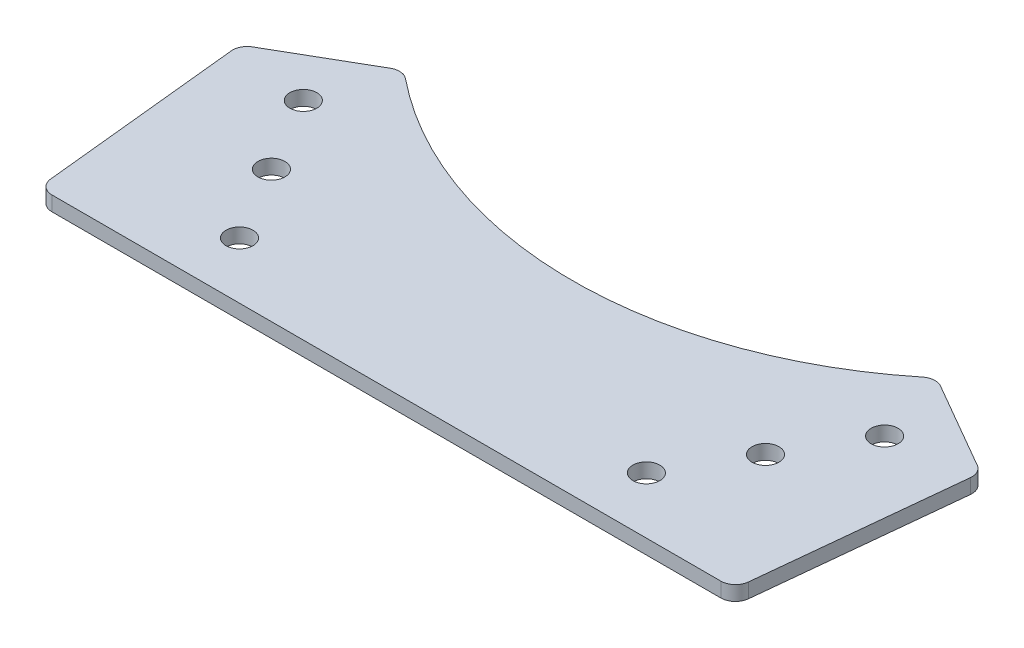
ISO-10303-21;
HEADER;
FILE_DESCRIPTION(('STEP AP214'),'2;1');
FILE_NAME('part.step','',(''),(''),'','','');
FILE_SCHEMA(('AUTOMOTIVE_DESIGN { 1 0 10303 214 1 1 1 1 }'));
ENDSEC;
DATA;
#1=APPLICATION_CONTEXT('core data for automotive mechanical design processes');
#2=APPLICATION_PROTOCOL_DEFINITION('international standard','automotive_design',2000,#1);
#3=PRODUCT_CONTEXT('',#1,'mechanical');
#4=PRODUCT('Part','Part','',(#3));
#5=PRODUCT_RELATED_PRODUCT_CATEGORY('part','',(#4));
#6=PRODUCT_DEFINITION_FORMATION('','',#4);
#7=PRODUCT_DEFINITION_CONTEXT('part definition',#1,'design');
#8=PRODUCT_DEFINITION('design','',#6,#7);
#9=PRODUCT_DEFINITION_SHAPE('','',#8);
#10=(LENGTH_UNIT() NAMED_UNIT(*) SI_UNIT(.MILLI.,.METRE.));
#11=(NAMED_UNIT(*) PLANE_ANGLE_UNIT() SI_UNIT($,.RADIAN.));
#12=(NAMED_UNIT(*) SI_UNIT($,.STERADIAN.) SOLID_ANGLE_UNIT());
#13=UNCERTAINTY_MEASURE_WITH_UNIT(LENGTH_MEASURE(1.E-05),#10,'distance_accuracy_value','');
#14=(GEOMETRIC_REPRESENTATION_CONTEXT(3) GLOBAL_UNCERTAINTY_ASSIGNED_CONTEXT((#13)) GLOBAL_UNIT_ASSIGNED_CONTEXT((#10,
#11,#12)) REPRESENTATION_CONTEXT('',''));
#15=CARTESIAN_POINT('',(0.,0.,0.));
#16=DIRECTION('',(0.,0.,1.));
#17=DIRECTION('',(1.,0.,0.));
#18=AXIS2_PLACEMENT_3D('',#15,#16,#17);
#19=CARTESIAN_POINT('',(0.,1.6,0.));
#20=DIRECTION('',(0.,1.,0.));
#21=DIRECTION('',(0.,0.,1.));
#22=AXIS2_PLACEMENT_3D('',#19,#20,#21);
#23=PLANE('',#22);
#24=CARTESIAN_POINT('',(26.9875000000006,1.6,-3.62722116926478));
#25=DIRECTION('',(0.,-1.,0.));
#26=DIRECTION('',(0.,0.,-1.));
#27=AXIS2_PLACEMENT_3D('',#24,#25,#26);
#28=CIRCLE('',#27,1.47319999999998);
#29=CARTESIAN_POINT('',(26.9875000000006,1.6,-5.10042116926477));
#30=VERTEX_POINT('',#29);
#31=EDGE_CURVE('E303',#30,#30,#28,.T.);
#32=ORIENTED_EDGE('',*,*,#31,.T.);
#33=EDGE_LOOP('',(#32));
#34=FACE_BOUND('',#33,.T.);
#35=CARTESIAN_POINT('',(-26.9875000000006,1.6,-3.62722116926478));
#36=DIRECTION('',(0.,-1.,0.));
#37=DIRECTION('',(0.,0.,-1.));
#38=AXIS2_PLACEMENT_3D('',#35,#36,#37);
#39=CIRCLE('',#38,1.47319999999998);
#40=CARTESIAN_POINT('',(-26.9875000000006,1.6,-5.10042116926477));
#41=VERTEX_POINT('',#40);
#42=EDGE_CURVE('E285',#41,#41,#39,.T.);
#43=ORIENTED_EDGE('',*,*,#42,.T.);
#44=EDGE_LOOP('',(#43));
#45=FACE_BOUND('',#44,.T.);
#46=DIRECTION('',(0.102215076971525,0.,-0.994762322386461));
#47=VECTOR('',#46,1.);
#48=CARTESIAN_POINT('',(38.1,1.6,9.525));
#49=LINE('',#48,#47);
#50=CARTESIAN_POINT('',(38.1159507557428,1.6,9.3697664346923));
#51=VERTEX_POINT('',#50);
#52=CARTESIAN_POINT('',(40.3761410282364,1.6,-12.6265201319886));
#53=VERTEX_POINT('',#52);
#54=EDGE_CURVE('E129',#51,#53,#49,.T.);
#55=ORIENTED_EDGE('',*,*,#54,.T.);
#56=CARTESIAN_POINT('',(38.7969558414479,1.6,-12.7887865666809));
#57=DIRECTION('',(0.,1.,0.));
#58=DIRECTION('',(0.,0.,1.));
#59=AXIS2_PLACEMENT_3D('',#56,#57,#58);
#60=CIRCLE('',#59,1.5875);
#61=CARTESIAN_POINT('',(39.5907058414478,1.6,-14.1636018951887));
#62=VERTEX_POINT('',#61);
#63=EDGE_CURVE('E123',#53,#62,#60,.T.);
#64=ORIENTED_EDGE('',*,*,#63,.T.);
#65=DIRECTION('',(-0.866025403784442,0.,-0.499999999999995));
#66=VECTOR('',#65,1.);
#67=CARTESIAN_POINT('',(40.48125,1.6,-13.6494459855234));
#68=LINE('',#67,#66);
#69=CARTESIAN_POINT('',(30.0464786074915,1.6,-19.6739640579203));
#70=VERTEX_POINT('',#69);
#71=EDGE_CURVE('E126',#62,#70,#68,.T.);
#72=ORIENTED_EDGE('',*,*,#71,.T.);
#73=CARTESIAN_POINT('',(29.2527286074915,1.6,-18.2991487294125));
#74=DIRECTION('',(0.,1.,0.));
#75=DIRECTION('',(0.,0.,1.));
#76=AXIS2_PLACEMENT_3D('',#73,#74,#75);
#77=CIRCLE('',#76,1.5875);
#78=CARTESIAN_POINT('',(28.2534790738512,1.6,-19.5327031949792));
#79=VERTEX_POINT('',#78);
#80=EDGE_CURVE('E171',#70,#79,#77,.T.);
#81=ORIENTED_EDGE('',*,*,#80,.T.);
#82=CARTESIAN_POINT('',(0.,1.6,-54.4110835254422));
#83=DIRECTION('',(0.,1.,0.));
#84=DIRECTION('',(0.,0.,1.));
#85=AXIS2_PLACEMENT_3D('',#82,#83,#84);
#86=CIRCLE('',#85,44.8860835254422);
#87=CARTESIAN_POINT('',(-28.2534790738512,1.6,-19.5327031949792));
#88=VERTEX_POINT('',#87);
#89=EDGE_CURVE('E200',#88,#79,#86,.T.);
#90=ORIENTED_EDGE('',*,*,#89,.F.);
#91=CARTESIAN_POINT('',(-29.2527286074915,1.6,-18.2991487294125));
#92=DIRECTION('',(0.,1.,0.));
#93=DIRECTION('',(0.,0.,1.));
#94=AXIS2_PLACEMENT_3D('',#91,#92,#93);
#95=CIRCLE('',#94,1.5875);
#96=CARTESIAN_POINT('',(-30.0464786074915,1.6,-19.6739640579203));
#97=VERTEX_POINT('',#96);
#98=EDGE_CURVE('E173',#88,#97,#95,.T.);
#99=ORIENTED_EDGE('',*,*,#98,.T.);
#100=DIRECTION('',(0.866025403784442,0.,-0.499999999999995));
#101=VECTOR('',#100,1.);
#102=CARTESIAN_POINT('',(-40.48125,1.6,-13.6494459855234));
#103=LINE('',#102,#101);
#104=CARTESIAN_POINT('',(-39.5907058414479,1.6,-14.1636018951887));
#105=VERTEX_POINT('',#104);
#106=EDGE_CURVE('E153',#105,#97,#103,.T.);
#107=ORIENTED_EDGE('',*,*,#106,.F.);
#108=CARTESIAN_POINT('',(-38.7969558414479,1.6,-12.7887865666809));
#109=DIRECTION('',(0.,1.,0.));
#110=DIRECTION('',(0.,0.,1.));
#111=AXIS2_PLACEMENT_3D('',#108,#109,#110);
#112=CIRCLE('',#111,1.5875);
#113=CARTESIAN_POINT('',(-40.3761410282364,1.6,-12.6265201319886));
#114=VERTEX_POINT('',#113);
#115=EDGE_CURVE('E175',#105,#114,#112,.T.);
#116=ORIENTED_EDGE('',*,*,#115,.T.);
#117=DIRECTION('',(-0.102215076971525,0.,-0.994762322386461));
#118=VECTOR('',#117,1.);
#119=CARTESIAN_POINT('',(-38.1,1.6,9.525));
#120=LINE('',#119,#118);
#121=CARTESIAN_POINT('',(-38.1159507557428,1.6,9.3697664346923));
#122=VERTEX_POINT('',#121);
#123=EDGE_CURVE('E220',#122,#114,#120,.T.);
#124=ORIENTED_EDGE('',*,*,#123,.F.);
#125=CARTESIAN_POINT('',(-36.5367655689543,1.6,9.2075));
#126=DIRECTION('',(0.,1.,0.));
#127=DIRECTION('',(0.,0.,1.));
#128=AXIS2_PLACEMENT_3D('',#125,#126,#127);
#129=CIRCLE('',#128,1.5875);
#130=CARTESIAN_POINT('',(-36.5367655689543,1.6,10.795));
#131=VERTEX_POINT('',#130);
#132=EDGE_CURVE('E48',#122,#131,#129,.T.);
#133=ORIENTED_EDGE('',*,*,#132,.T.);
#134=DIRECTION('',(-1.,0.,0.));
#135=VECTOR('',#134,1.);
#136=CARTESIAN_POINT('',(-37.9695033528789,1.6,10.795));
#137=LINE('',#136,#135);
#138=CARTESIAN_POINT('',(36.5367655689543,1.6,10.795));
#139=VERTEX_POINT('',#138);
#140=EDGE_CURVE('E206',#139,#131,#137,.T.);
#141=ORIENTED_EDGE('',*,*,#140,.F.);
#142=CARTESIAN_POINT('',(36.5367655689543,1.6,9.2075));
#143=DIRECTION('',(0.,1.,0.));
#144=DIRECTION('',(0.,0.,1.));
#145=AXIS2_PLACEMENT_3D('',#142,#143,#144);
#146=CIRCLE('',#145,1.5875);
#147=EDGE_CURVE('E134',#139,#51,#146,.T.);
#148=ORIENTED_EDGE('',*,*,#147,.T.);
#149=EDGE_LOOP('',(#55,#64,#72,#81,#90,#99,#107,#116,#124,#133,#141,#148));
#150=FACE_BOUND('',#149,.T.);
#151=CARTESIAN_POINT('',(-31.7500000000007,1.6,-11.8761131403115));
#152=DIRECTION('',(0.,-1.,0.));
#153=DIRECTION('',(0.,0.,-1.));
#154=AXIS2_PLACEMENT_3D('',#151,#152,#153);
#155=CIRCLE('',#154,1.47319999999998);
#156=CARTESIAN_POINT('',(-31.7500000000007,1.6,-13.3493131403115));
#157=VERTEX_POINT('',#156);
#158=EDGE_CURVE('E278',#157,#157,#155,.T.);
#159=ORIENTED_EDGE('',*,*,#158,.T.);
#160=EDGE_LOOP('',(#159));
#161=FACE_BOUND('',#160,.T.);
#162=CARTESIAN_POINT('',(-22.2250000000005,1.6,4.62167080178193));
#163=DIRECTION('',(0.,-1.,0.));
#164=DIRECTION('',(0.,0.,-1.));
#165=AXIS2_PLACEMENT_3D('',#162,#163,#164);
#166=CIRCLE('',#165,1.47319999999998);
#167=CARTESIAN_POINT('',(-22.2250000000005,1.6,3.14847080178195));
#168=VERTEX_POINT('',#167);
#169=EDGE_CURVE('E291',#168,#168,#166,.T.);
#170=ORIENTED_EDGE('',*,*,#169,.T.);
#171=EDGE_LOOP('',(#170));
#172=FACE_BOUND('',#171,.T.);
#173=CARTESIAN_POINT('',(31.7500000000007,1.6,-11.8761131403115));
#174=DIRECTION('',(0.,-1.,0.));
#175=DIRECTION('',(0.,0.,-1.));
#176=AXIS2_PLACEMENT_3D('',#173,#174,#175);
#177=CIRCLE('',#176,1.47319999999999);
#178=CARTESIAN_POINT('',(31.7500000000007,1.6,-13.3493131403115));
#179=VERTEX_POINT('',#178);
#180=EDGE_CURVE('E297',#179,#179,#177,.T.);
#181=ORIENTED_EDGE('',*,*,#180,.T.);
#182=EDGE_LOOP('',(#181));
#183=FACE_BOUND('',#182,.T.);
#184=CARTESIAN_POINT('',(22.2250000000005,1.6,4.62167080178193));
#185=DIRECTION('',(0.,-1.,0.));
#186=DIRECTION('',(0.,0.,-1.));
#187=AXIS2_PLACEMENT_3D('',#184,#185,#186);
#188=CIRCLE('',#187,1.47319999999998);
#189=CARTESIAN_POINT('',(22.2250000000005,1.6,3.14847080178195));
#190=VERTEX_POINT('',#189);
#191=EDGE_CURVE('E308',#190,#190,#188,.T.);
#192=ORIENTED_EDGE('',*,*,#191,.T.);
#193=EDGE_LOOP('',(#192));
#194=FACE_BOUND('',#193,.T.);
#195=ADVANCED_FACE('F33',(#34,#45,#150,#161,#172,#183,#194),#23,.T.);
#196=CARTESIAN_POINT('',(0.,0.,0.));
#197=DIRECTION('',(0.,1.,0.));
#198=DIRECTION('',(0.,0.,1.));
#199=AXIS2_PLACEMENT_3D('',#196,#197,#198);
#200=PLANE('',#199);
#201=CARTESIAN_POINT('',(22.2250000000005,0.,4.62167080178193));
#202=DIRECTION('',(0.,-1.,0.));
#203=DIRECTION('',(0.,0.,-1.));
#204=AXIS2_PLACEMENT_3D('',#201,#202,#203);
#205=CIRCLE('',#204,1.47319999999998);
#206=CARTESIAN_POINT('',(22.2250000000005,0.,3.14847080178195));
#207=VERTEX_POINT('',#206);
#208=EDGE_CURVE('E311',#207,#207,#205,.T.);
#209=ORIENTED_EDGE('',*,*,#208,.F.);
#210=EDGE_LOOP('',(#209));
#211=FACE_BOUND('',#210,.T.);
#212=CARTESIAN_POINT('',(26.9875000000006,0.,-3.62722116926478));
#213=DIRECTION('',(0.,-1.,0.));
#214=DIRECTION('',(0.,0.,-1.));
#215=AXIS2_PLACEMENT_3D('',#212,#213,#214);
#216=CIRCLE('',#215,1.47319999999998);
#217=CARTESIAN_POINT('',(26.9875000000006,0.,-5.10042116926477));
#218=VERTEX_POINT('',#217);
#219=EDGE_CURVE('E305',#218,#218,#216,.T.);
#220=ORIENTED_EDGE('',*,*,#219,.F.);
#221=EDGE_LOOP('',(#220));
#222=FACE_BOUND('',#221,.T.);
#223=CARTESIAN_POINT('',(31.7500000000007,0.,-11.8761131403115));
#224=DIRECTION('',(0.,-1.,0.));
#225=DIRECTION('',(0.,0.,-1.));
#226=AXIS2_PLACEMENT_3D('',#223,#224,#225);
#227=CIRCLE('',#226,1.47319999999999);
#228=CARTESIAN_POINT('',(31.7500000000007,0.,-13.3493131403115));
#229=VERTEX_POINT('',#228);
#230=EDGE_CURVE('E300',#229,#229,#227,.T.);
#231=ORIENTED_EDGE('',*,*,#230,.F.);
#232=EDGE_LOOP('',(#231));
#233=FACE_BOUND('',#232,.T.);
#234=CARTESIAN_POINT('',(-22.2250000000005,0.,4.62167080178193));
#235=DIRECTION('',(0.,-1.,0.));
#236=DIRECTION('',(0.,0.,-1.));
#237=AXIS2_PLACEMENT_3D('',#234,#235,#236);
#238=CIRCLE('',#237,1.47319999999998);
#239=CARTESIAN_POINT('',(-22.2250000000005,0.,3.14847080178195));
#240=VERTEX_POINT('',#239);
#241=EDGE_CURVE('E294',#240,#240,#238,.T.);
#242=ORIENTED_EDGE('',*,*,#241,.F.);
#243=EDGE_LOOP('',(#242));
#244=FACE_BOUND('',#243,.T.);
#245=CARTESIAN_POINT('',(-26.9875000000006,0.,-3.62722116926478));
#246=DIRECTION('',(0.,-1.,0.));
#247=DIRECTION('',(0.,0.,-1.));
#248=AXIS2_PLACEMENT_3D('',#245,#246,#247);
#249=CIRCLE('',#248,1.47319999999998);
#250=CARTESIAN_POINT('',(-26.9875000000006,0.,-5.10042116926477));
#251=VERTEX_POINT('',#250);
#252=EDGE_CURVE('E288',#251,#251,#249,.T.);
#253=ORIENTED_EDGE('',*,*,#252,.F.);
#254=EDGE_LOOP('',(#253));
#255=FACE_BOUND('',#254,.T.);
#256=DIRECTION('',(-0.866025403784442,0.,-0.499999999999995));
#257=VECTOR('',#256,1.);
#258=CARTESIAN_POINT('',(40.48125,0.,-13.6494459855234));
#259=LINE('',#258,#257);
#260=CARTESIAN_POINT('',(39.5907058414478,0.,-14.1636018951887));
#261=VERTEX_POINT('',#260);
#262=CARTESIAN_POINT('',(30.0464786074915,0.,-19.6739640579203));
#263=VERTEX_POINT('',#262);
#264=EDGE_CURVE('E145',#261,#263,#259,.T.);
#265=ORIENTED_EDGE('',*,*,#264,.F.);
#266=CARTESIAN_POINT('',(38.7969558414479,0.,-12.7887865666809));
#267=DIRECTION('',(0.,1.,0.));
#268=DIRECTION('',(0.,0.,1.));
#269=AXIS2_PLACEMENT_3D('',#266,#267,#268);
#270=CIRCLE('',#269,1.5875);
#271=CARTESIAN_POINT('',(40.3761410282364,0.,-12.6265201319886));
#272=VERTEX_POINT('',#271);
#273=EDGE_CURVE('E148',#261,#272,#270,.F.);
#274=ORIENTED_EDGE('',*,*,#273,.T.);
#275=DIRECTION('',(0.102215076971525,0.,-0.994762322386461));
#276=VECTOR('',#275,1.);
#277=CARTESIAN_POINT('',(38.1,0.,9.525));
#278=LINE('',#277,#276);
#279=CARTESIAN_POINT('',(38.1159507557428,0.,9.3697664346923));
#280=VERTEX_POINT('',#279);
#281=EDGE_CURVE('E208',#280,#272,#278,.T.);
#282=ORIENTED_EDGE('',*,*,#281,.F.);
#283=CARTESIAN_POINT('',(36.5367655689543,0.,9.2075));
#284=DIRECTION('',(0.,1.,0.));
#285=DIRECTION('',(0.,0.,1.));
#286=AXIS2_PLACEMENT_3D('',#283,#284,#285);
#287=CIRCLE('',#286,1.5875);
#288=CARTESIAN_POINT('',(36.5367655689543,0.,10.795));
#289=VERTEX_POINT('',#288);
#290=EDGE_CURVE('E162',#280,#289,#287,.F.);
#291=ORIENTED_EDGE('',*,*,#290,.T.);
#292=DIRECTION('',(-1.,0.,0.));
#293=VECTOR('',#292,1.);
#294=CARTESIAN_POINT('',(-37.9695033528789,0.,10.795));
#295=LINE('',#294,#293);
#296=CARTESIAN_POINT('',(-36.5367655689543,0.,10.795));
#297=VERTEX_POINT('',#296);
#298=EDGE_CURVE('E210',#289,#297,#295,.T.);
#299=ORIENTED_EDGE('',*,*,#298,.T.);
#300=CARTESIAN_POINT('',(-36.5367655689543,0.,9.2075));
#301=DIRECTION('',(0.,1.,0.));
#302=DIRECTION('',(0.,0.,1.));
#303=AXIS2_PLACEMENT_3D('',#300,#301,#302);
#304=CIRCLE('',#303,1.5875);
#305=CARTESIAN_POINT('',(-38.1159507557428,0.,9.3697664346923));
#306=VERTEX_POINT('',#305);
#307=EDGE_CURVE('E149',#297,#306,#304,.F.);
#308=ORIENTED_EDGE('',*,*,#307,.T.);
#309=DIRECTION('',(-0.102215076971525,0.,-0.994762322386461));
#310=VECTOR('',#309,1.);
#311=CARTESIAN_POINT('',(-38.1,0.,9.525));
#312=LINE('',#311,#310);
#313=CARTESIAN_POINT('',(-40.3761410282364,0.,-12.6265201319886));
#314=VERTEX_POINT('',#313);
#315=EDGE_CURVE('E144',#306,#314,#312,.T.);
#316=ORIENTED_EDGE('',*,*,#315,.T.);
#317=CARTESIAN_POINT('',(-38.7969558414479,0.,-12.7887865666809));
#318=DIRECTION('',(0.,1.,0.));
#319=DIRECTION('',(0.,0.,1.));
#320=AXIS2_PLACEMENT_3D('',#317,#318,#319);
#321=CIRCLE('',#320,1.5875);
#322=CARTESIAN_POINT('',(-39.5907058414479,0.,-14.1636018951887));
#323=VERTEX_POINT('',#322);
#324=EDGE_CURVE('E160',#314,#323,#321,.F.);
#325=ORIENTED_EDGE('',*,*,#324,.T.);
#326=DIRECTION('',(0.866025403784442,0.,-0.499999999999995));
#327=VECTOR('',#326,1.);
#328=CARTESIAN_POINT('',(-40.48125,0.,-13.6494459855234));
#329=LINE('',#328,#327);
#330=CARTESIAN_POINT('',(-30.0464786074915,0.,-19.6739640579203));
#331=VERTEX_POINT('',#330);
#332=EDGE_CURVE('E223',#323,#331,#329,.T.);
#333=ORIENTED_EDGE('',*,*,#332,.T.);
#334=CARTESIAN_POINT('',(-29.2527286074915,0.,-18.2991487294125));
#335=DIRECTION('',(0.,1.,0.));
#336=DIRECTION('',(0.,0.,1.));
#337=AXIS2_PLACEMENT_3D('',#334,#335,#336);
#338=CIRCLE('',#337,1.5875);
#339=CARTESIAN_POINT('',(-28.2534790738512,0.,-19.5327031949792));
#340=VERTEX_POINT('',#339);
#341=EDGE_CURVE('E158',#331,#340,#338,.F.);
#342=ORIENTED_EDGE('',*,*,#341,.T.);
#343=CARTESIAN_POINT('',(0.,0.,-54.4110835254422));
#344=DIRECTION('',(0.,1.,0.));
#345=DIRECTION('',(0.,0.,1.));
#346=AXIS2_PLACEMENT_3D('',#343,#344,#345);
#347=CIRCLE('',#346,44.8860835254422);
#348=CARTESIAN_POINT('',(28.2534790738512,0.,-19.5327031949792));
#349=VERTEX_POINT('',#348);
#350=EDGE_CURVE('E197',#340,#349,#347,.T.);
#351=ORIENTED_EDGE('',*,*,#350,.T.);
#352=CARTESIAN_POINT('',(29.2527286074915,0.,-18.2991487294125));
#353=DIRECTION('',(0.,1.,0.));
#354=DIRECTION('',(0.,0.,1.));
#355=AXIS2_PLACEMENT_3D('',#352,#353,#354);
#356=CIRCLE('',#355,1.5875);
#357=EDGE_CURVE('E151',#349,#263,#356,.F.);
#358=ORIENTED_EDGE('',*,*,#357,.T.);
#359=EDGE_LOOP('',(#265,#274,#282,#291,#299,#308,#316,#325,#333,#342,#351,#358));
#360=FACE_BOUND('',#359,.T.);
#361=CARTESIAN_POINT('',(-31.7500000000007,0.,-11.8761131403115));
#362=DIRECTION('',(0.,-1.,0.));
#363=DIRECTION('',(0.,0.,-1.));
#364=AXIS2_PLACEMENT_3D('',#361,#362,#363);
#365=CIRCLE('',#364,1.47319999999998);
#366=CARTESIAN_POINT('',(-31.7500000000007,0.,-13.3493131403115));
#367=VERTEX_POINT('',#366);
#368=EDGE_CURVE('E280',#367,#367,#365,.T.);
#369=ORIENTED_EDGE('',*,*,#368,.F.);
#370=EDGE_LOOP('',(#369));
#371=FACE_BOUND('',#370,.T.);
#372=ADVANCED_FACE('F203',(#211,#222,#233,#244,#255,#360,#371),#200,.F.);
#373=CARTESIAN_POINT('',(-40.48125,26.2431222027927,-13.6494459855234));
#374=DIRECTION('',(-0.499999999999995,0.,-0.866025403784442));
#375=DIRECTION('',(-0.866025403784442,0.,0.499999999999995));
#376=AXIS2_PLACEMENT_3D('',#373,#374,#375);
#377=PLANE('',#376);
#378=ORIENTED_EDGE('',*,*,#332,.F.);
#379=DIRECTION('',(0.,-1.,0.));
#380=VECTOR('',#379,1.);
#381=CARTESIAN_POINT('',(-39.5907058414479,26.2431222027927,-14.1636018951887));
#382=LINE('',#381,#380);
#383=EDGE_CURVE('E189',#323,#105,#382,.F.);
#384=ORIENTED_EDGE('',*,*,#383,.T.);
#385=ORIENTED_EDGE('',*,*,#106,.T.);
#386=DIRECTION('',(0.,-1.,0.));
#387=VECTOR('',#386,1.);
#388=CARTESIAN_POINT('',(-30.0464786074915,26.2431222027927,-19.6739640579203));
#389=LINE('',#388,#387);
#390=EDGE_CURVE('E186',#97,#331,#389,.T.);
#391=ORIENTED_EDGE('',*,*,#390,.T.);
#392=EDGE_LOOP('',(#378,#384,#385,#391));
#393=FACE_BOUND('',#392,.T.);
#394=ADVANCED_FACE('F229',(#393),#377,.T.);
#395=CARTESIAN_POINT('',(-38.1,30.6823153380624,9.525));
#396=DIRECTION('',(-0.994762322386461,0.,0.102215076971525));
#397=DIRECTION('',(0.102215076971525,0.,0.994762322386461));
#398=AXIS2_PLACEMENT_3D('',#395,#396,#397);
#399=PLANE('',#398);
#400=ORIENTED_EDGE('',*,*,#123,.T.);
#401=DIRECTION('',(0.,-1.,0.));
#402=VECTOR('',#401,1.);
#403=CARTESIAN_POINT('',(-40.3761410282364,30.6823153380624,-12.6265201319886));
#404=LINE('',#403,#402);
#405=EDGE_CURVE('E183',#114,#314,#404,.T.);
#406=ORIENTED_EDGE('',*,*,#405,.T.);
#407=ORIENTED_EDGE('',*,*,#315,.F.);
#408=DIRECTION('',(0.,-1.,0.));
#409=VECTOR('',#408,1.);
#410=CARTESIAN_POINT('',(-38.1159507557428,30.6823153380624,9.3697664346923));
#411=LINE('',#410,#409);
#412=EDGE_CURVE('E181',#306,#122,#411,.F.);
#413=ORIENTED_EDGE('',*,*,#412,.T.);
#414=EDGE_LOOP('',(#400,#406,#407,#413));
#415=FACE_BOUND('',#414,.T.);
#416=ADVANCED_FACE('F272',(#415),#399,.T.);
#417=CARTESIAN_POINT('',(40.48125,26.2431222027927,-13.6494459855234));
#418=DIRECTION('',(-0.499999999999995,0.,0.866025403784442));
#419=DIRECTION('',(0.866025403784442,0.,0.499999999999995));
#420=AXIS2_PLACEMENT_3D('',#417,#418,#419);
#421=PLANE('',#420);
#422=ORIENTED_EDGE('',*,*,#71,.F.);
#423=DIRECTION('',(0.,-1.,0.));
#424=VECTOR('',#423,1.);
#425=CARTESIAN_POINT('',(39.5907058414478,26.2431222027927,-14.1636018951887));
#426=LINE('',#425,#424);
#427=EDGE_CURVE('E140',#62,#261,#426,.T.);
#428=ORIENTED_EDGE('',*,*,#427,.T.);
#429=ORIENTED_EDGE('',*,*,#264,.T.);
#430=DIRECTION('',(0.,1.,0.));
#431=VECTOR('',#430,1.);
#432=CARTESIAN_POINT('',(30.0464786074915,1.6,-19.6739640579203));
#433=LINE('',#432,#431);
#434=EDGE_CURVE('E143',#263,#70,#433,.T.);
#435=ORIENTED_EDGE('',*,*,#434,.T.);
#436=EDGE_LOOP('',(#422,#428,#429,#435));
#437=FACE_BOUND('',#436,.T.);
#438=ADVANCED_FACE('F138',(#437),#421,.F.);
#439=CARTESIAN_POINT('',(38.1,30.6823153380624,9.525));
#440=DIRECTION('',(-0.994762322386461,0.,-0.102215076971525));
#441=DIRECTION('',(-0.102215076971525,0.,0.994762322386461));
#442=AXIS2_PLACEMENT_3D('',#439,#440,#441);
#443=PLANE('',#442);
#444=ORIENTED_EDGE('',*,*,#281,.T.);
#445=DIRECTION('',(0.,-1.,0.));
#446=VECTOR('',#445,1.);
#447=CARTESIAN_POINT('',(40.3761410282364,30.6823153380624,-12.6265201319886));
#448=LINE('',#447,#446);
#449=EDGE_CURVE('E168',#272,#53,#448,.F.);
#450=ORIENTED_EDGE('',*,*,#449,.T.);
#451=ORIENTED_EDGE('',*,*,#54,.F.);
#452=DIRECTION('',(0.,-1.,0.));
#453=VECTOR('',#452,1.);
#454=CARTESIAN_POINT('',(38.1159507557428,0.,9.3697664346923));
#455=LINE('',#454,#453);
#456=EDGE_CURVE('E165',#51,#280,#455,.T.);
#457=ORIENTED_EDGE('',*,*,#456,.T.);
#458=EDGE_LOOP('',(#444,#450,#451,#457));
#459=FACE_BOUND('',#458,.T.);
#460=ADVANCED_FACE('F346',(#459),#443,.F.);
#461=CARTESIAN_POINT('',(0.,66.9444237996702,-54.4110835254422));
#462=DIRECTION('',(0.,-1.,0.));
#463=DIRECTION('',(0.,0.,-1.));
#464=AXIS2_PLACEMENT_3D('',#461,#462,#463);
#465=CYLINDRICAL_SURFACE('',#464,44.8860835254422);
#466=ORIENTED_EDGE('',*,*,#350,.F.);
#467=DIRECTION('',(0.,-1.,0.));
#468=VECTOR('',#467,1.);
#469=CARTESIAN_POINT('',(-28.2534790738512,66.9444237996702,-19.5327031949792));
#470=LINE('',#469,#468);
#471=EDGE_CURVE('E11',#340,#88,#470,.F.);
#472=ORIENTED_EDGE('',*,*,#471,.T.);
#473=ORIENTED_EDGE('',*,*,#89,.T.);
#474=DIRECTION('',(0.,-1.,0.));
#475=VECTOR('',#474,1.);
#476=CARTESIAN_POINT('',(28.2534790738512,66.9444237996702,-19.5327031949792));
#477=LINE('',#476,#475);
#478=EDGE_CURVE('E41',#79,#349,#477,.T.);
#479=ORIENTED_EDGE('',*,*,#478,.T.);
#480=EDGE_LOOP('',(#466,#472,#473,#479));
#481=FACE_BOUND('',#480,.T.);
#482=ADVANCED_FACE('F196',(#481),#465,.F.);
#483=CARTESIAN_POINT('',(-37.9695033528789,77.8105825984817,10.795));
#484=DIRECTION('',(0.,0.,1.));
#485=DIRECTION('',(1.,0.,0.));
#486=AXIS2_PLACEMENT_3D('',#483,#484,#485);
#487=PLANE('',#486);
#488=ORIENTED_EDGE('',*,*,#298,.F.);
#489=DIRECTION('',(0.,-1.,0.));
#490=VECTOR('',#489,1.);
#491=CARTESIAN_POINT('',(36.5367655689543,1.60000000000003,10.795));
#492=LINE('',#491,#490);
#493=EDGE_CURVE('E55',#289,#139,#492,.F.);
#494=ORIENTED_EDGE('',*,*,#493,.T.);
#495=ORIENTED_EDGE('',*,*,#140,.T.);
#496=DIRECTION('',(0.,-1.,0.));
#497=VECTOR('',#496,1.);
#498=CARTESIAN_POINT('',(-36.5367655689543,77.8105825984817,10.795));
#499=LINE('',#498,#497);
#500=EDGE_CURVE('E133',#131,#297,#499,.T.);
#501=ORIENTED_EDGE('',*,*,#500,.T.);
#502=EDGE_LOOP('',(#488,#494,#495,#501));
#503=FACE_BOUND('',#502,.T.);
#504=ADVANCED_FACE('F262',(#503),#487,.T.);
#505=CARTESIAN_POINT('',(38.7969558414479,26.2431222027927,-12.7887865666809));
#506=DIRECTION('',(0.,-1.,0.));
#507=DIRECTION('',(0.,0.,-1.));
#508=AXIS2_PLACEMENT_3D('',#505,#506,#507);
#509=CYLINDRICAL_SURFACE('',#508,1.5875);
#510=ORIENTED_EDGE('',*,*,#63,.F.);
#511=ORIENTED_EDGE('',*,*,#449,.F.);
#512=ORIENTED_EDGE('',*,*,#273,.F.);
#513=ORIENTED_EDGE('',*,*,#427,.F.);
#514=EDGE_LOOP('',(#510,#511,#512,#513));
#515=FACE_BOUND('',#514,.T.);
#516=ADVANCED_FACE('F147',(#515),#509,.T.);
#517=CARTESIAN_POINT('',(36.5367655689543,30.6823153380624,9.2075));
#518=DIRECTION('',(0.,1.,0.));
#519=DIRECTION('',(0.,0.,1.));
#520=AXIS2_PLACEMENT_3D('',#517,#518,#519);
#521=CYLINDRICAL_SURFACE('',#520,1.5875);
#522=ORIENTED_EDGE('',*,*,#147,.F.);
#523=ORIENTED_EDGE('',*,*,#493,.F.);
#524=ORIENTED_EDGE('',*,*,#290,.F.);
#525=ORIENTED_EDGE('',*,*,#456,.F.);
#526=EDGE_LOOP('',(#522,#523,#524,#525));
#527=FACE_BOUND('',#526,.T.);
#528=ADVANCED_FACE('F261',(#527),#521,.T.);
#529=CARTESIAN_POINT('',(-38.7969558414479,30.6823153380624,-12.7887865666809));
#530=DIRECTION('',(0.,-1.,0.));
#531=DIRECTION('',(0.,0.,-1.));
#532=AXIS2_PLACEMENT_3D('',#529,#530,#531);
#533=CYLINDRICAL_SURFACE('',#532,1.5875);
#534=ORIENTED_EDGE('',*,*,#115,.F.);
#535=ORIENTED_EDGE('',*,*,#383,.F.);
#536=ORIENTED_EDGE('',*,*,#324,.F.);
#537=ORIENTED_EDGE('',*,*,#405,.F.);
#538=EDGE_LOOP('',(#534,#535,#536,#537));
#539=FACE_BOUND('',#538,.T.);
#540=ADVANCED_FACE('F243',(#539),#533,.T.);
#541=CARTESIAN_POINT('',(-29.2527286074915,66.9444237996702,-18.2991487294125));
#542=DIRECTION('',(0.,-1.,0.));
#543=DIRECTION('',(0.,0.,-1.));
#544=AXIS2_PLACEMENT_3D('',#541,#542,#543);
#545=CYLINDRICAL_SURFACE('',#544,1.5875);
#546=ORIENTED_EDGE('',*,*,#98,.F.);
#547=ORIENTED_EDGE('',*,*,#471,.F.);
#548=ORIENTED_EDGE('',*,*,#341,.F.);
#549=ORIENTED_EDGE('',*,*,#390,.F.);
#550=EDGE_LOOP('',(#546,#547,#548,#549));
#551=FACE_BOUND('',#550,.T.);
#552=ADVANCED_FACE('F234',(#551),#545,.T.);
#553=CARTESIAN_POINT('',(29.2527286074915,66.9444237996702,-18.2991487294125));
#554=DIRECTION('',(0.,-1.,0.));
#555=DIRECTION('',(0.,0.,-1.));
#556=AXIS2_PLACEMENT_3D('',#553,#554,#555);
#557=CYLINDRICAL_SURFACE('',#556,1.5875);
#558=ORIENTED_EDGE('',*,*,#80,.F.);
#559=ORIENTED_EDGE('',*,*,#434,.F.);
#560=ORIENTED_EDGE('',*,*,#357,.F.);
#561=ORIENTED_EDGE('',*,*,#478,.F.);
#562=EDGE_LOOP('',(#558,#559,#560,#561));
#563=FACE_BOUND('',#562,.T.);
#564=ADVANCED_FACE('F235',(#563),#557,.T.);
#565=CARTESIAN_POINT('',(-36.5367655689543,77.8105825984817,9.2075));
#566=DIRECTION('',(0.,-1.,0.));
#567=DIRECTION('',(0.,0.,-1.));
#568=AXIS2_PLACEMENT_3D('',#565,#566,#567);
#569=CYLINDRICAL_SURFACE('',#568,1.5875);
#570=ORIENTED_EDGE('',*,*,#132,.F.);
#571=ORIENTED_EDGE('',*,*,#412,.F.);
#572=ORIENTED_EDGE('',*,*,#307,.F.);
#573=ORIENTED_EDGE('',*,*,#500,.F.);
#574=EDGE_LOOP('',(#570,#571,#572,#573));
#575=FACE_BOUND('',#574,.T.);
#576=ADVANCED_FACE('F35',(#575),#569,.T.);
#577=CARTESIAN_POINT('',(-31.7500000000007,0.,-11.8761131403115));
#578=DIRECTION('',(0.,-1.,0.));
#579=DIRECTION('',(0.,0.,-1.));
#580=AXIS2_PLACEMENT_3D('',#577,#578,#579);
#581=CYLINDRICAL_SURFACE('',#580,1.47319999999998);
#582=ORIENTED_EDGE('',*,*,#158,.F.);
#583=EDGE_LOOP('',(#582));
#584=FACE_BOUND('',#583,.T.);
#585=ORIENTED_EDGE('',*,*,#368,.T.);
#586=EDGE_LOOP('',(#585));
#587=FACE_BOUND('',#586,.T.);
#588=ADVANCED_FACE('F241',(#584,#587),#581,.F.);
#589=CARTESIAN_POINT('',(-26.9875000000006,0.,-3.62722116926478));
#590=DIRECTION('',(0.,-1.,0.));
#591=DIRECTION('',(0.,0.,-1.));
#592=AXIS2_PLACEMENT_3D('',#589,#590,#591);
#593=CYLINDRICAL_SURFACE('',#592,1.47319999999998);
#594=ORIENTED_EDGE('',*,*,#42,.F.);
#595=EDGE_LOOP('',(#594));
#596=FACE_BOUND('',#595,.T.);
#597=ORIENTED_EDGE('',*,*,#252,.T.);
#598=EDGE_LOOP('',(#597));
#599=FACE_BOUND('',#598,.T.);
#600=ADVANCED_FACE('F325',(#596,#599),#593,.F.);
#601=CARTESIAN_POINT('',(-22.2250000000005,0.,4.62167080178193));
#602=DIRECTION('',(0.,-1.,0.));
#603=DIRECTION('',(0.,0.,-1.));
#604=AXIS2_PLACEMENT_3D('',#601,#602,#603);
#605=CYLINDRICAL_SURFACE('',#604,1.47319999999998);
#606=ORIENTED_EDGE('',*,*,#169,.F.);
#607=EDGE_LOOP('',(#606));
#608=FACE_BOUND('',#607,.T.);
#609=ORIENTED_EDGE('',*,*,#241,.T.);
#610=EDGE_LOOP('',(#609));
#611=FACE_BOUND('',#610,.T.);
#612=ADVANCED_FACE('F327',(#608,#611),#605,.F.);
#613=CARTESIAN_POINT('',(31.7500000000007,0.,-11.8761131403115));
#614=DIRECTION('',(0.,-1.,0.));
#615=DIRECTION('',(0.,0.,-1.));
#616=AXIS2_PLACEMENT_3D('',#613,#614,#615);
#617=CYLINDRICAL_SURFACE('',#616,1.47319999999999);
#618=ORIENTED_EDGE('',*,*,#180,.F.);
#619=EDGE_LOOP('',(#618));
#620=FACE_BOUND('',#619,.T.);
#621=ORIENTED_EDGE('',*,*,#230,.T.);
#622=EDGE_LOOP('',(#621));
#623=FACE_BOUND('',#622,.T.);
#624=ADVANCED_FACE('F334',(#620,#623),#617,.F.);
#625=CARTESIAN_POINT('',(26.9875000000006,0.,-3.62722116926478));
#626=DIRECTION('',(0.,-1.,0.));
#627=DIRECTION('',(0.,0.,-1.));
#628=AXIS2_PLACEMENT_3D('',#625,#626,#627);
#629=CYLINDRICAL_SURFACE('',#628,1.47319999999998);
#630=ORIENTED_EDGE('',*,*,#31,.F.);
#631=EDGE_LOOP('',(#630));
#632=FACE_BOUND('',#631,.T.);
#633=ORIENTED_EDGE('',*,*,#219,.T.);
#634=EDGE_LOOP('',(#633));
#635=FACE_BOUND('',#634,.T.);
#636=ADVANCED_FACE('F447',(#632,#635),#629,.F.);
#637=CARTESIAN_POINT('',(22.2250000000005,0.,4.62167080178193));
#638=DIRECTION('',(0.,-1.,0.));
#639=DIRECTION('',(0.,0.,-1.));
#640=AXIS2_PLACEMENT_3D('',#637,#638,#639);
#641=CYLINDRICAL_SURFACE('',#640,1.47319999999998);
#642=ORIENTED_EDGE('',*,*,#191,.F.);
#643=EDGE_LOOP('',(#642));
#644=FACE_BOUND('',#643,.T.);
#645=ORIENTED_EDGE('',*,*,#208,.T.);
#646=EDGE_LOOP('',(#645));
#647=FACE_BOUND('',#646,.T.);
#648=ADVANCED_FACE('F315',(#644,#647),#641,.F.);
#649=CLOSED_SHELL('',(#195,#372,#394,#416,#438,#460,#482,#504,#516,#528,#540,#552,#564,#576,
#588,#600,#612,#624,#636,#648));
#650=MANIFOLD_SOLID_BREP('B2',#649);
#651=ADVANCED_BREP_SHAPE_REPRESENTATION('',(#18,#650),#14);
#652=SHAPE_DEFINITION_REPRESENTATION(#9,#651);
ENDSEC;
END-ISO-10303-21;
